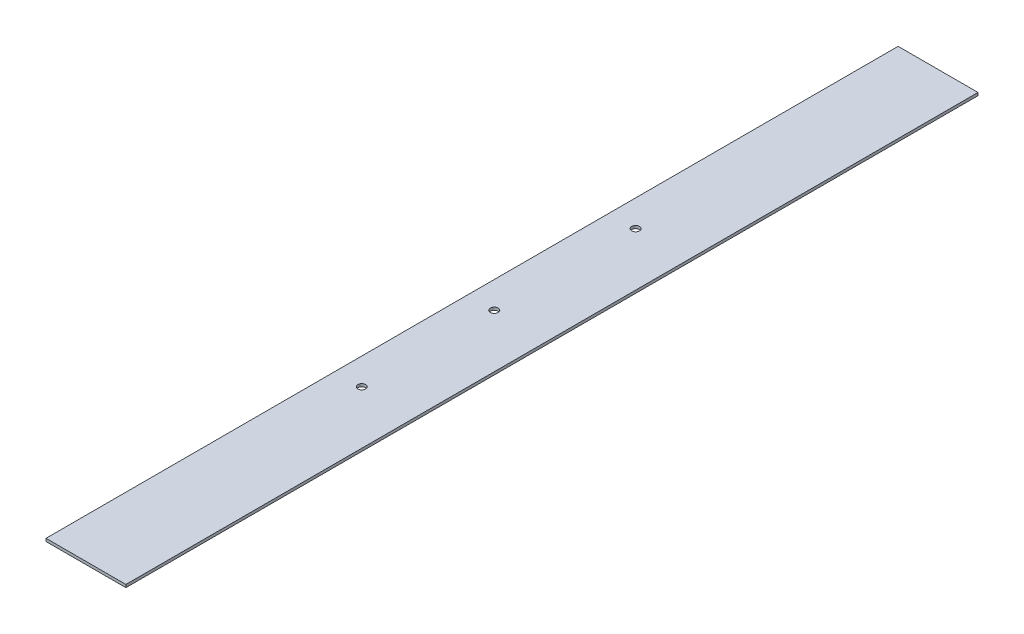
ISO-10303-21;
HEADER;
FILE_DESCRIPTION(('STEP AP214'),'2;1');
FILE_NAME('part.step','',(''),(''),'','','');
FILE_SCHEMA(('AUTOMOTIVE_DESIGN { 1 0 10303 214 1 1 1 1 }'));
ENDSEC;
DATA;
#1=APPLICATION_CONTEXT('core data for automotive mechanical design processes');
#2=APPLICATION_PROTOCOL_DEFINITION('international standard','automotive_design',2000,#1);
#3=PRODUCT_CONTEXT('',#1,'mechanical');
#4=PRODUCT('Part','Part','',(#3));
#5=PRODUCT_RELATED_PRODUCT_CATEGORY('part','',(#4));
#6=PRODUCT_DEFINITION_FORMATION('','',#4);
#7=PRODUCT_DEFINITION_CONTEXT('part definition',#1,'design');
#8=PRODUCT_DEFINITION('design','',#6,#7);
#9=PRODUCT_DEFINITION_SHAPE('','',#8);
#10=(LENGTH_UNIT() NAMED_UNIT(*) SI_UNIT(.MILLI.,.METRE.));
#11=(NAMED_UNIT(*) PLANE_ANGLE_UNIT() SI_UNIT($,.RADIAN.));
#12=(NAMED_UNIT(*) SI_UNIT($,.STERADIAN.) SOLID_ANGLE_UNIT());
#13=UNCERTAINTY_MEASURE_WITH_UNIT(LENGTH_MEASURE(1.E-05),#10,'distance_accuracy_value','');
#14=(GEOMETRIC_REPRESENTATION_CONTEXT(3) GLOBAL_UNCERTAINTY_ASSIGNED_CONTEXT((#13)) GLOBAL_UNIT_ASSIGNED_CONTEXT((#10,
#11,#12)) REPRESENTATION_CONTEXT('',''));
#15=CARTESIAN_POINT('',(0.,0.,0.));
#16=DIRECTION('',(0.,0.,1.));
#17=DIRECTION('',(1.,0.,0.));
#18=AXIS2_PLACEMENT_3D('',#15,#16,#17);
#19=CARTESIAN_POINT('',(-173.489347611488,472.173427831157,90.7755469976339));
#20=DIRECTION('',(0.,-1.,0.));
#21=DIRECTION('',(0.,0.,-1.));
#22=AXIS2_PLACEMENT_3D('',#19,#20,#21);
#23=PLANE('',#22);
#24=CARTESIAN_POINT('',(16.5106523885107,472.173427831157,20.2932256674514));
#25=DIRECTION('',(0.,-1.,0.));
#26=DIRECTION('',(0.,0.,-1.));
#27=AXIS2_PLACEMENT_3D('',#24,#25,#26);
#28=CIRCLE('',#27,4.4);
#29=CARTESIAN_POINT('',(16.5106523885107,472.173427831157,15.8932256674514));
#30=VERTEX_POINT('',#29);
#31=EDGE_CURVE('E88',#30,#30,#28,.T.);
#32=ORIENTED_EDGE('',*,*,#31,.T.);
#33=EDGE_LOOP('',(#32));
#34=FACE_BOUND('',#33,.T.);
#35=CARTESIAN_POINT('',(16.5106523885107,472.173427831157,-128.949999916275));
#36=DIRECTION('',(0.,-1.,0.));
#37=DIRECTION('',(0.,0.,-1.));
#38=AXIS2_PLACEMENT_3D('',#35,#36,#37);
#39=CIRCLE('',#38,4.4);
#40=CARTESIAN_POINT('',(16.5106523885107,472.173427831157,-133.349999916275));
#41=VERTEX_POINT('',#40);
#42=EDGE_CURVE('E91',#41,#41,#39,.T.);
#43=ORIENTED_EDGE('',*,*,#42,.T.);
#44=EDGE_LOOP('',(#43));
#45=FACE_BOUND('',#44,.T.);
#46=CARTESIAN_POINT('',(16.5106523885107,472.173427831157,-288.193225500002));
#47=DIRECTION('',(0.,-1.,0.));
#48=DIRECTION('',(0.,0.,-1.));
#49=AXIS2_PLACEMENT_3D('',#46,#47,#48);
#50=CIRCLE('',#49,4.4);
#51=CARTESIAN_POINT('',(16.5106523885107,472.173427831157,-292.593225500002));
#52=VERTEX_POINT('',#51);
#53=EDGE_CURVE('E20',#52,#52,#50,.T.);
#54=ORIENTED_EDGE('',*,*,#53,.T.);
#55=EDGE_LOOP('',(#54));
#56=FACE_BOUND('',#55,.T.);
#57=DIRECTION('',(0.,0.,1.));
#58=VECTOR('',#57,1.);
#59=CARTESIAN_POINT('',(-13.4893476114887,472.173427831157,-523.85));
#60=LINE('',#59,#58);
#61=CARTESIAN_POINT('',(-13.4893476114887,472.173427831157,346.05));
#62=VERTEX_POINT('',#61);
#63=CARTESIAN_POINT('',(-13.4893476114887,472.173427831157,-613.95));
#64=VERTEX_POINT('',#63);
#65=EDGE_CURVE('E55',#62,#64,#60,.F.);
#66=ORIENTED_EDGE('',*,*,#65,.F.);
#67=DIRECTION('',(1.,0.,0.));
#68=VECTOR('',#67,1.);
#69=CARTESIAN_POINT('',(6.51065238851132,472.173427831157,346.05));
#70=LINE('',#69,#68);
#71=CARTESIAN_POINT('',(76.5106523885113,472.173427831157,346.05));
#72=VERTEX_POINT('',#71);
#73=EDGE_CURVE('E57',#72,#62,#70,.F.);
#74=ORIENTED_EDGE('',*,*,#73,.F.);
#75=DIRECTION('',(0.,0.,-1.));
#76=VECTOR('',#75,1.);
#77=CARTESIAN_POINT('',(76.5106523885113,472.173427831157,255.95));
#78=LINE('',#77,#76);
#79=CARTESIAN_POINT('',(76.5106523885113,472.173427831157,-613.95));
#80=VERTEX_POINT('',#79);
#81=EDGE_CURVE('E59',#80,#72,#78,.F.);
#82=ORIENTED_EDGE('',*,*,#81,.F.);
#83=DIRECTION('',(-1.,0.,0.));
#84=VECTOR('',#83,1.);
#85=CARTESIAN_POINT('',(76.5106523885113,472.173427831157,-613.95));
#86=LINE('',#85,#84);
#87=EDGE_CURVE('E100',#64,#80,#86,.F.);
#88=ORIENTED_EDGE('',*,*,#87,.F.);
#89=EDGE_LOOP('',(#66,#74,#82,#88));
#90=FACE_BOUND('',#89,.T.);
#91=ADVANCED_FACE('F17',(#34,#45,#56,#90),#23,.F.);
#92=CARTESIAN_POINT('',(76.5106523885113,472.173427831157,255.95));
#93=DIRECTION('',(1.,0.,0.));
#94=DIRECTION('',(0.,0.,-1.));
#95=AXIS2_PLACEMENT_3D('',#92,#93,#94);
#96=PLANE('',#95);
#97=DIRECTION('',(0.,0.,-1.));
#98=VECTOR('',#97,1.);
#99=CARTESIAN_POINT('',(76.5106523885113,468.998427831157,90.7755469976339));
#100=LINE('',#99,#98);
#101=CARTESIAN_POINT('',(76.5106523885113,468.998427831157,-613.95));
#102=VERTEX_POINT('',#101);
#103=CARTESIAN_POINT('',(76.5106523885113,468.998427831157,346.05));
#104=VERTEX_POINT('',#103);
#105=EDGE_CURVE('E90',#102,#104,#100,.F.);
#106=ORIENTED_EDGE('',*,*,#105,.F.);
#107=DIRECTION('',(0.,1.,0.));
#108=VECTOR('',#107,1.);
#109=CARTESIAN_POINT('',(76.5106523885113,472.173427831157,-613.95));
#110=LINE('',#109,#108);
#111=EDGE_CURVE('E70',#80,#102,#110,.F.);
#112=ORIENTED_EDGE('',*,*,#111,.F.);
#113=ORIENTED_EDGE('',*,*,#81,.T.);
#114=DIRECTION('',(0.,1.,0.));
#115=VECTOR('',#114,1.);
#116=CARTESIAN_POINT('',(76.5106523885113,472.173427831157,346.05));
#117=LINE('',#116,#115);
#118=EDGE_CURVE('E64',#104,#72,#117,.T.);
#119=ORIENTED_EDGE('',*,*,#118,.F.);
#120=EDGE_LOOP('',(#106,#112,#113,#119));
#121=FACE_BOUND('',#120,.T.);
#122=ADVANCED_FACE('F67',(#121),#96,.T.);
#123=CARTESIAN_POINT('',(6.51065238851132,472.173427831157,346.05));
#124=DIRECTION('',(0.,0.,1.));
#125=DIRECTION('',(1.,0.,0.));
#126=AXIS2_PLACEMENT_3D('',#123,#124,#125);
#127=PLANE('',#126);
#128=DIRECTION('',(1.,0.,0.));
#129=VECTOR('',#128,1.);
#130=CARTESIAN_POINT('',(-173.489347611488,468.998427831157,346.05));
#131=LINE('',#130,#129);
#132=CARTESIAN_POINT('',(-13.4893476114887,468.998427831157,346.05));
#133=VERTEX_POINT('',#132);
#134=EDGE_CURVE('E75',#104,#133,#131,.F.);
#135=ORIENTED_EDGE('',*,*,#134,.F.);
#136=ORIENTED_EDGE('',*,*,#118,.T.);
#137=ORIENTED_EDGE('',*,*,#73,.T.);
#138=DIRECTION('',(0.,1.,0.));
#139=VECTOR('',#138,1.);
#140=CARTESIAN_POINT('',(-13.4893476114887,472.173427831157,346.05));
#141=LINE('',#140,#139);
#142=EDGE_CURVE('E78',#133,#62,#141,.T.);
#143=ORIENTED_EDGE('',*,*,#142,.F.);
#144=EDGE_LOOP('',(#135,#136,#137,#143));
#145=FACE_BOUND('',#144,.T.);
#146=ADVANCED_FACE('F73',(#145),#127,.T.);
#147=CARTESIAN_POINT('',(-13.4893476114887,472.173427831157,-523.85));
#148=DIRECTION('',(-1.,0.,0.));
#149=DIRECTION('',(0.,0.,1.));
#150=AXIS2_PLACEMENT_3D('',#147,#148,#149);
#151=PLANE('',#150);
#152=DIRECTION('',(0.,0.,-1.));
#153=VECTOR('',#152,1.);
#154=CARTESIAN_POINT('',(-13.4893476114887,468.998427831157,90.7755469976339));
#155=LINE('',#154,#153);
#156=CARTESIAN_POINT('',(-13.4893476114887,468.998427831157,-613.95));
#157=VERTEX_POINT('',#156);
#158=EDGE_CURVE('E107',#133,#157,#155,.T.);
#159=ORIENTED_EDGE('',*,*,#158,.F.);
#160=ORIENTED_EDGE('',*,*,#142,.T.);
#161=ORIENTED_EDGE('',*,*,#65,.T.);
#162=DIRECTION('',(0.,1.,0.));
#163=VECTOR('',#162,1.);
#164=CARTESIAN_POINT('',(-13.4893476114887,472.173427831157,-613.95));
#165=LINE('',#164,#163);
#166=EDGE_CURVE('E35',#157,#64,#165,.T.);
#167=ORIENTED_EDGE('',*,*,#166,.F.);
#168=EDGE_LOOP('',(#159,#160,#161,#167));
#169=FACE_BOUND('',#168,.T.);
#170=ADVANCED_FACE('F105',(#169),#151,.T.);
#171=CARTESIAN_POINT('',(76.5106523885113,472.173427831157,-613.95));
#172=DIRECTION('',(0.,0.,-1.));
#173=DIRECTION('',(-1.,0.,0.));
#174=AXIS2_PLACEMENT_3D('',#171,#172,#173);
#175=PLANE('',#174);
#176=DIRECTION('',(1.,0.,0.));
#177=VECTOR('',#176,1.);
#178=CARTESIAN_POINT('',(-173.489347611488,468.998427831157,-613.95));
#179=LINE('',#178,#177);
#180=EDGE_CURVE('E87',#157,#102,#179,.T.);
#181=ORIENTED_EDGE('',*,*,#180,.F.);
#182=ORIENTED_EDGE('',*,*,#166,.T.);
#183=ORIENTED_EDGE('',*,*,#87,.T.);
#184=ORIENTED_EDGE('',*,*,#111,.T.);
#185=EDGE_LOOP('',(#181,#182,#183,#184));
#186=FACE_BOUND('',#185,.T.);
#187=ADVANCED_FACE('F113',(#186),#175,.T.);
#188=CARTESIAN_POINT('',(16.5106523885107,472.490930231157,-288.193225500002));
#189=DIRECTION('',(0.,-1.,0.));
#190=DIRECTION('',(0.,0.,-1.));
#191=AXIS2_PLACEMENT_3D('',#188,#189,#190);
#192=CYLINDRICAL_SURFACE('',#191,4.4);
#193=CARTESIAN_POINT('',(16.5106523885107,468.998427831157,-288.193225500002));
#194=DIRECTION('',(0.,-1.,0.));
#195=DIRECTION('',(0.,0.,-1.));
#196=AXIS2_PLACEMENT_3D('',#193,#194,#195);
#197=CIRCLE('',#196,4.4);
#198=CARTESIAN_POINT('',(16.5106523885107,468.998427831157,-292.593225500002));
#199=VERTEX_POINT('',#198);
#200=EDGE_CURVE('E84',#199,#199,#197,.F.);
#201=ORIENTED_EDGE('',*,*,#200,.F.);
#202=EDGE_LOOP('',(#201));
#203=FACE_BOUND('',#202,.T.);
#204=ORIENTED_EDGE('',*,*,#53,.F.);
#205=EDGE_LOOP('',(#204));
#206=FACE_BOUND('',#205,.T.);
#207=ADVANCED_FACE('F115',(#203,#206),#192,.F.);
#208=CARTESIAN_POINT('',(16.5106523885107,472.490930231157,-128.949999916275));
#209=DIRECTION('',(0.,-1.,0.));
#210=DIRECTION('',(0.,0.,-1.));
#211=AXIS2_PLACEMENT_3D('',#208,#209,#210);
#212=CYLINDRICAL_SURFACE('',#211,4.4);
#213=CARTESIAN_POINT('',(16.5106523885107,468.998427831157,-128.949999916275));
#214=DIRECTION('',(0.,-1.,0.));
#215=DIRECTION('',(0.,0.,-1.));
#216=AXIS2_PLACEMENT_3D('',#213,#214,#215);
#217=CIRCLE('',#216,4.4);
#218=CARTESIAN_POINT('',(16.5106523885107,468.998427831157,-133.349999916275));
#219=VERTEX_POINT('',#218);
#220=EDGE_CURVE('E26',#219,#219,#217,.F.);
#221=ORIENTED_EDGE('',*,*,#220,.F.);
#222=EDGE_LOOP('',(#221));
#223=FACE_BOUND('',#222,.T.);
#224=ORIENTED_EDGE('',*,*,#42,.F.);
#225=EDGE_LOOP('',(#224));
#226=FACE_BOUND('',#225,.T.);
#227=ADVANCED_FACE('F122',(#223,#226),#212,.F.);
#228=CARTESIAN_POINT('',(16.5106523885107,472.490930231157,20.2932256674514));
#229=DIRECTION('',(0.,-1.,0.));
#230=DIRECTION('',(0.,0.,-1.));
#231=AXIS2_PLACEMENT_3D('',#228,#229,#230);
#232=CYLINDRICAL_SURFACE('',#231,4.4);
#233=CARTESIAN_POINT('',(16.5106523885107,468.998427831157,20.2932256674514));
#234=DIRECTION('',(0.,-1.,0.));
#235=DIRECTION('',(0.,0.,-1.));
#236=AXIS2_PLACEMENT_3D('',#233,#234,#235);
#237=CIRCLE('',#236,4.4);
#238=CARTESIAN_POINT('',(16.5106523885107,468.998427831157,15.8932256674514));
#239=VERTEX_POINT('',#238);
#240=EDGE_CURVE('E11',#239,#239,#237,.F.);
#241=ORIENTED_EDGE('',*,*,#240,.F.);
#242=EDGE_LOOP('',(#241));
#243=FACE_BOUND('',#242,.T.);
#244=ORIENTED_EDGE('',*,*,#31,.F.);
#245=EDGE_LOOP('',(#244));
#246=FACE_BOUND('',#245,.T.);
#247=ADVANCED_FACE('F127',(#243,#246),#232,.F.);
#248=CARTESIAN_POINT('',(-173.489347611488,468.998427831157,90.7755469976339));
#249=DIRECTION('',(0.,-1.,0.));
#250=DIRECTION('',(0.,0.,-1.));
#251=AXIS2_PLACEMENT_3D('',#248,#249,#250);
#252=PLANE('',#251);
#253=ORIENTED_EDGE('',*,*,#240,.T.);
#254=EDGE_LOOP('',(#253));
#255=FACE_BOUND('',#254,.T.);
#256=ORIENTED_EDGE('',*,*,#220,.T.);
#257=EDGE_LOOP('',(#256));
#258=FACE_BOUND('',#257,.T.);
#259=ORIENTED_EDGE('',*,*,#200,.T.);
#260=EDGE_LOOP('',(#259));
#261=FACE_BOUND('',#260,.T.);
#262=ORIENTED_EDGE('',*,*,#158,.T.);
#263=ORIENTED_EDGE('',*,*,#180,.T.);
#264=ORIENTED_EDGE('',*,*,#105,.T.);
#265=ORIENTED_EDGE('',*,*,#134,.T.);
#266=EDGE_LOOP('',(#262,#263,#264,#265));
#267=FACE_BOUND('',#266,.T.);
#268=ADVANCED_FACE('F111',(#255,#258,#261,#267),#252,.T.);
#269=CLOSED_SHELL('',(#91,#122,#146,#170,#187,#207,#227,#247,#268));
#270=MANIFOLD_SOLID_BREP('B1',#269);
#271=ADVANCED_BREP_SHAPE_REPRESENTATION('',(#18,#270),#14);
#272=SHAPE_DEFINITION_REPRESENTATION(#9,#271);
ENDSEC;
END-ISO-10303-21;
